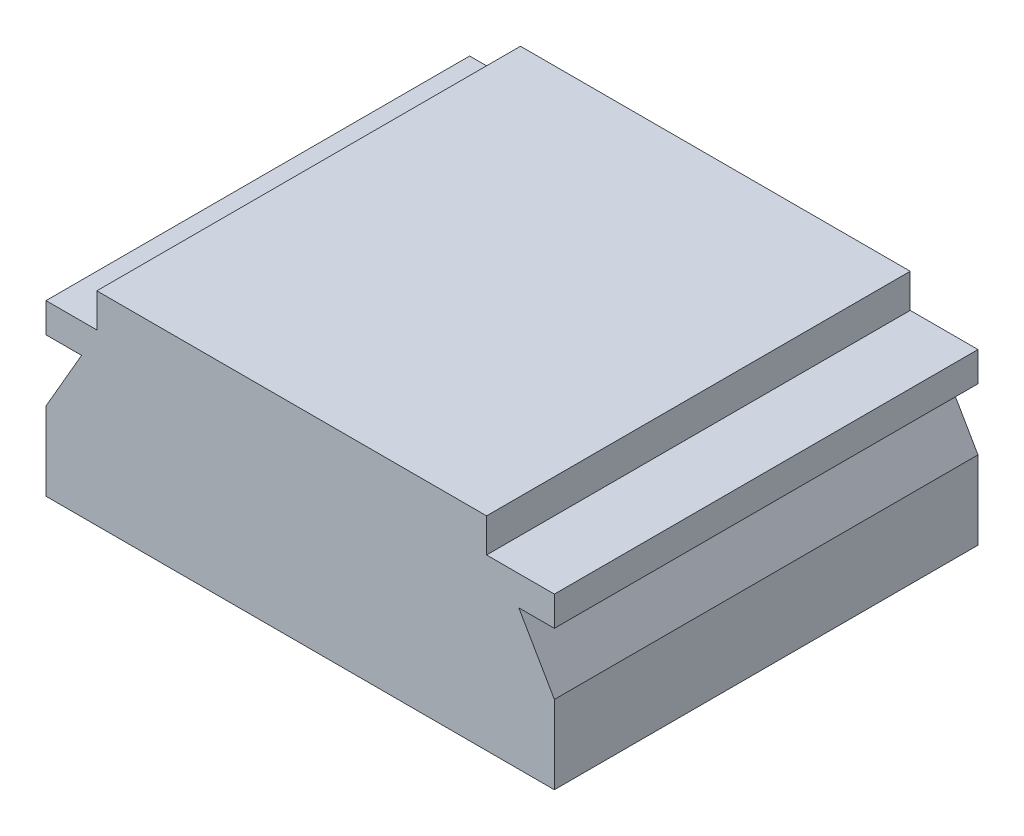
ISO-10303-21;
HEADER;
FILE_DESCRIPTION(('STEP AP214'),'2;1');
FILE_NAME('part.step','',(''),(''),'','','');
FILE_SCHEMA(('AUTOMOTIVE_DESIGN { 1 0 10303 214 1 1 1 1 }'));
ENDSEC;
DATA;
#1=APPLICATION_CONTEXT('core data for automotive mechanical design processes');
#2=APPLICATION_PROTOCOL_DEFINITION('international standard','automotive_design',2000,#1);
#3=PRODUCT_CONTEXT('',#1,'mechanical');
#4=PRODUCT('Part','Part','',(#3));
#5=PRODUCT_RELATED_PRODUCT_CATEGORY('part','',(#4));
#6=PRODUCT_DEFINITION_FORMATION('','',#4);
#7=PRODUCT_DEFINITION_CONTEXT('part definition',#1,'design');
#8=PRODUCT_DEFINITION('design','',#6,#7);
#9=PRODUCT_DEFINITION_SHAPE('','',#8);
#10=(LENGTH_UNIT() NAMED_UNIT(*) SI_UNIT(.MILLI.,.METRE.));
#11=(NAMED_UNIT(*) PLANE_ANGLE_UNIT() SI_UNIT($,.RADIAN.));
#12=(NAMED_UNIT(*) SI_UNIT($,.STERADIAN.) SOLID_ANGLE_UNIT());
#13=UNCERTAINTY_MEASURE_WITH_UNIT(LENGTH_MEASURE(1.E-05),#10,'distance_accuracy_value','');
#14=(GEOMETRIC_REPRESENTATION_CONTEXT(3) GLOBAL_UNCERTAINTY_ASSIGNED_CONTEXT((#13)) GLOBAL_UNIT_ASSIGNED_CONTEXT((#10,
#11,#12)) REPRESENTATION_CONTEXT('',''));
#15=CARTESIAN_POINT('',(0.,0.,0.));
#16=DIRECTION('',(0.,0.,1.));
#17=DIRECTION('',(1.,0.,0.));
#18=AXIS2_PLACEMENT_3D('',#15,#16,#17);
#19=CARTESIAN_POINT('',(-6.2,2.5,10.));
#20=DIRECTION('',(0.,-1.,0.));
#21=DIRECTION('',(0.,0.,-1.));
#22=AXIS2_PLACEMENT_3D('',#19,#20,#21);
#23=PLANE('',#22);
#24=DIRECTION('',(-1.,0.,0.));
#25=VECTOR('',#24,1.);
#26=CARTESIAN_POINT('',(-6.2,2.5,10.));
#27=LINE('',#26,#25);
#28=CARTESIAN_POINT('',(4.40000000000001,2.5,10.));
#29=VERTEX_POINT('',#28);
#30=CARTESIAN_POINT('',(-4.8,2.5,10.));
#31=VERTEX_POINT('',#30);
#32=EDGE_CURVE('E11',#29,#31,#27,.T.);
#33=ORIENTED_EDGE('',*,*,#32,.F.);
#34=DIRECTION('',(0.,0.,-1.));
#35=VECTOR('',#34,1.);
#36=CARTESIAN_POINT('',(4.40000000000001,2.5,10.));
#37=LINE('',#36,#35);
#38=CARTESIAN_POINT('',(4.40000000000001,2.5,0.));
#39=VERTEX_POINT('',#38);
#40=EDGE_CURVE('E64',#29,#39,#37,.T.);
#41=ORIENTED_EDGE('',*,*,#40,.T.);
#42=DIRECTION('',(-1.,0.,0.));
#43=VECTOR('',#42,1.);
#44=CARTESIAN_POINT('',(-6.2,2.5,0.));
#45=LINE('',#44,#43);
#46=CARTESIAN_POINT('',(-4.8,2.5,0.));
#47=VERTEX_POINT('',#46);
#48=EDGE_CURVE('E44',#39,#47,#45,.T.);
#49=ORIENTED_EDGE('',*,*,#48,.T.);
#50=DIRECTION('',(0.,0.,-1.));
#51=VECTOR('',#50,1.);
#52=CARTESIAN_POINT('',(-4.8,2.5,10.));
#53=LINE('',#52,#51);
#54=EDGE_CURVE('E55',#31,#47,#53,.T.);
#55=ORIENTED_EDGE('',*,*,#54,.F.);
#56=EDGE_LOOP('',(#33,#41,#49,#55));
#57=FACE_BOUND('',#56,.T.);
#58=ADVANCED_FACE('F41',(#57),#23,.F.);
#59=CARTESIAN_POINT('',(0.,0.,10.));
#60=DIRECTION('',(0.,0.,1.));
#61=DIRECTION('',(1.,0.,0.));
#62=AXIS2_PLACEMENT_3D('',#59,#60,#61);
#63=PLANE('',#62);
#64=DIRECTION('',(0.,1.,0.));
#65=VECTOR('',#64,1.);
#66=CARTESIAN_POINT('',(4.40000000000001,0.,10.));
#67=LINE('',#66,#65);
#68=CARTESIAN_POINT('',(4.40000000000001,1.69999999999999,10.));
#69=VERTEX_POINT('',#68);
#70=EDGE_CURVE('E165',#69,#29,#67,.T.);
#71=ORIENTED_EDGE('',*,*,#70,.T.);
#72=ORIENTED_EDGE('',*,*,#32,.T.);
#73=DIRECTION('',(0.,-1.,0.));
#74=VECTOR('',#73,1.);
#75=CARTESIAN_POINT('',(-4.8,0.,10.));
#76=LINE('',#75,#74);
#77=CARTESIAN_POINT('',(-4.8,1.7,10.));
#78=VERTEX_POINT('',#77);
#79=EDGE_CURVE('E114',#31,#78,#76,.T.);
#80=ORIENTED_EDGE('',*,*,#79,.T.);
#81=DIRECTION('',(-1.,0.,0.));
#82=VECTOR('',#81,1.);
#83=CARTESIAN_POINT('',(0.,1.7,10.));
#84=LINE('',#83,#82);
#85=CARTESIAN_POINT('',(-6.,1.7,10.));
#86=VERTEX_POINT('',#85);
#87=EDGE_CURVE('E237',#78,#86,#84,.T.);
#88=ORIENTED_EDGE('',*,*,#87,.T.);
#89=DIRECTION('',(0.,-1.,0.));
#90=VECTOR('',#89,1.);
#91=CARTESIAN_POINT('',(-6.,0.,10.));
#92=LINE('',#91,#90);
#93=CARTESIAN_POINT('',(-6.,1.00000000000001,10.));
#94=VERTEX_POINT('',#93);
#95=EDGE_CURVE('E250',#86,#94,#92,.T.);
#96=ORIENTED_EDGE('',*,*,#95,.T.);
#97=DIRECTION('',(1.,0.,0.));
#98=VECTOR('',#97,1.);
#99=CARTESIAN_POINT('',(0.,1.00000000000001,10.));
#100=LINE('',#99,#98);
#101=CARTESIAN_POINT('',(-5.16076951545867,1.00000000000001,10.));
#102=VERTEX_POINT('',#101);
#103=EDGE_CURVE('E252',#94,#102,#100,.T.);
#104=ORIENTED_EDGE('',*,*,#103,.T.);
#105=DIRECTION('',(-0.5,-0.866025403784439,0.));
#106=VECTOR('',#105,1.);
#107=CARTESIAN_POINT('',(-4.30358983848623,2.48467875173176,10.));
#108=LINE('',#107,#106);
#109=CARTESIAN_POINT('',(-6.,-0.453589838486223,10.));
#110=VERTEX_POINT('',#109);
#111=EDGE_CURVE('E258',#102,#110,#108,.T.);
#112=ORIENTED_EDGE('',*,*,#111,.T.);
#113=DIRECTION('',(0.,-1.,0.));
#114=VECTOR('',#113,1.);
#115=CARTESIAN_POINT('',(-6.,0.,10.));
#116=LINE('',#115,#114);
#117=CARTESIAN_POINT('',(-6.,-2.3,10.));
#118=VERTEX_POINT('',#117);
#119=EDGE_CURVE('E261',#110,#118,#116,.T.);
#120=ORIENTED_EDGE('',*,*,#119,.T.);
#121=DIRECTION('',(1.,0.,0.));
#122=VECTOR('',#121,1.);
#123=CARTESIAN_POINT('',(0.,-2.3,10.));
#124=LINE('',#123,#122);
#125=CARTESIAN_POINT('',(6.00000000000001,-2.3,10.));
#126=VERTEX_POINT('',#125);
#127=EDGE_CURVE('E264',#118,#126,#124,.T.);
#128=ORIENTED_EDGE('',*,*,#127,.T.);
#129=DIRECTION('',(0.,1.,0.));
#130=VECTOR('',#129,1.);
#131=CARTESIAN_POINT('',(6.00000000000001,0.,10.));
#132=LINE('',#131,#130);
#133=CARTESIAN_POINT('',(6.00000000000001,-0.453589838486223,10.));
#134=VERTEX_POINT('',#133);
#135=EDGE_CURVE('E267',#126,#134,#132,.T.);
#136=ORIENTED_EDGE('',*,*,#135,.T.);
#137=DIRECTION('',(-0.5,0.866025403784439,0.));
#138=VECTOR('',#137,1.);
#139=CARTESIAN_POINT('',(4.30358983848623,2.48467875173176,10.));
#140=LINE('',#139,#138);
#141=CARTESIAN_POINT('',(5.16076951545868,0.999999999999999,10.));
#142=VERTEX_POINT('',#141);
#143=EDGE_CURVE('E172',#134,#142,#140,.T.);
#144=ORIENTED_EDGE('',*,*,#143,.T.);
#145=DIRECTION('',(1.,0.,0.));
#146=VECTOR('',#145,1.);
#147=CARTESIAN_POINT('',(0.,0.999999999999999,10.));
#148=LINE('',#147,#146);
#149=CARTESIAN_POINT('',(6.00000000000001,0.999999999999999,10.));
#150=VERTEX_POINT('',#149);
#151=EDGE_CURVE('E170',#142,#150,#148,.T.);
#152=ORIENTED_EDGE('',*,*,#151,.T.);
#153=DIRECTION('',(0.,1.,0.));
#154=VECTOR('',#153,1.);
#155=CARTESIAN_POINT('',(6.00000000000001,0.,10.));
#156=LINE('',#155,#154);
#157=CARTESIAN_POINT('',(6.00000000000001,1.69999999999999,10.));
#158=VERTEX_POINT('',#157);
#159=EDGE_CURVE('E151',#150,#158,#156,.T.);
#160=ORIENTED_EDGE('',*,*,#159,.T.);
#161=DIRECTION('',(-1.,0.,0.));
#162=VECTOR('',#161,1.);
#163=CARTESIAN_POINT('',(0.,1.69999999999999,10.));
#164=LINE('',#163,#162);
#165=EDGE_CURVE('E162',#158,#69,#164,.T.);
#166=ORIENTED_EDGE('',*,*,#165,.T.);
#167=EDGE_LOOP('',(#71,#72,#80,#88,#96,#104,#112,#120,#128,#136,#144,#152,#160,#166));
#168=FACE_BOUND('',#167,.T.);
#169=ADVANCED_FACE('F167',(#168),#63,.T.);
#170=CARTESIAN_POINT('',(0.,0.,0.));
#171=DIRECTION('',(0.,0.,1.));
#172=DIRECTION('',(1.,0.,0.));
#173=AXIS2_PLACEMENT_3D('',#170,#171,#172);
#174=PLANE('',#173);
#175=ORIENTED_EDGE('',*,*,#48,.F.);
#176=DIRECTION('',(0.,1.,0.));
#177=VECTOR('',#176,1.);
#178=CARTESIAN_POINT('',(4.40000000000001,0.,0.));
#179=LINE('',#178,#177);
#180=CARTESIAN_POINT('',(4.40000000000001,1.69999999999999,0.));
#181=VERTEX_POINT('',#180);
#182=EDGE_CURVE('E109',#181,#39,#179,.T.);
#183=ORIENTED_EDGE('',*,*,#182,.F.);
#184=DIRECTION('',(-1.,0.,0.));
#185=VECTOR('',#184,1.);
#186=CARTESIAN_POINT('',(0.,1.69999999999999,0.));
#187=LINE('',#186,#185);
#188=CARTESIAN_POINT('',(6.00000000000001,1.69999999999999,0.));
#189=VERTEX_POINT('',#188);
#190=EDGE_CURVE('E207',#189,#181,#187,.T.);
#191=ORIENTED_EDGE('',*,*,#190,.F.);
#192=DIRECTION('',(0.,1.,0.));
#193=VECTOR('',#192,1.);
#194=CARTESIAN_POINT('',(6.00000000000001,0.,0.));
#195=LINE('',#194,#193);
#196=CARTESIAN_POINT('',(6.00000000000001,0.999999999999999,0.));
#197=VERTEX_POINT('',#196);
#198=EDGE_CURVE('E154',#197,#189,#195,.T.);
#199=ORIENTED_EDGE('',*,*,#198,.F.);
#200=DIRECTION('',(1.,0.,0.));
#201=VECTOR('',#200,1.);
#202=CARTESIAN_POINT('',(0.,0.999999999999999,0.));
#203=LINE('',#202,#201);
#204=CARTESIAN_POINT('',(5.16076951545868,0.999999999999999,0.));
#205=VERTEX_POINT('',#204);
#206=EDGE_CURVE('E203',#205,#197,#203,.T.);
#207=ORIENTED_EDGE('',*,*,#206,.F.);
#208=DIRECTION('',(-0.5,0.866025403784439,0.));
#209=VECTOR('',#208,1.);
#210=CARTESIAN_POINT('',(4.30358983848623,2.48467875173176,0.));
#211=LINE('',#210,#209);
#212=CARTESIAN_POINT('',(6.00000000000001,-0.453589838486223,0.));
#213=VERTEX_POINT('',#212);
#214=EDGE_CURVE('E200',#213,#205,#211,.T.);
#215=ORIENTED_EDGE('',*,*,#214,.F.);
#216=DIRECTION('',(0.,1.,0.));
#217=VECTOR('',#216,1.);
#218=CARTESIAN_POINT('',(6.00000000000001,0.,0.));
#219=LINE('',#218,#217);
#220=CARTESIAN_POINT('',(6.00000000000001,-2.3,0.));
#221=VERTEX_POINT('',#220);
#222=EDGE_CURVE('E197',#221,#213,#219,.T.);
#223=ORIENTED_EDGE('',*,*,#222,.F.);
#224=DIRECTION('',(1.,0.,0.));
#225=VECTOR('',#224,1.);
#226=CARTESIAN_POINT('',(0.,-2.3,0.));
#227=LINE('',#226,#225);
#228=CARTESIAN_POINT('',(-6.,-2.3,0.));
#229=VERTEX_POINT('',#228);
#230=EDGE_CURVE('E194',#229,#221,#227,.T.);
#231=ORIENTED_EDGE('',*,*,#230,.F.);
#232=DIRECTION('',(0.,-1.,0.));
#233=VECTOR('',#232,1.);
#234=CARTESIAN_POINT('',(-6.,0.,0.));
#235=LINE('',#234,#233);
#236=CARTESIAN_POINT('',(-6.,-0.453589838486223,0.));
#237=VERTEX_POINT('',#236);
#238=EDGE_CURVE('E191',#237,#229,#235,.T.);
#239=ORIENTED_EDGE('',*,*,#238,.F.);
#240=DIRECTION('',(-0.5,-0.866025403784439,0.));
#241=VECTOR('',#240,1.);
#242=CARTESIAN_POINT('',(-4.30358983848623,2.48467875173176,0.));
#243=LINE('',#242,#241);
#244=CARTESIAN_POINT('',(-5.16076951545867,1.00000000000001,0.));
#245=VERTEX_POINT('',#244);
#246=EDGE_CURVE('E188',#245,#237,#243,.T.);
#247=ORIENTED_EDGE('',*,*,#246,.F.);
#248=DIRECTION('',(1.,0.,0.));
#249=VECTOR('',#248,1.);
#250=CARTESIAN_POINT('',(0.,1.00000000000001,0.));
#251=LINE('',#250,#249);
#252=CARTESIAN_POINT('',(-6.,1.00000000000001,0.));
#253=VERTEX_POINT('',#252);
#254=EDGE_CURVE('E185',#253,#245,#251,.T.);
#255=ORIENTED_EDGE('',*,*,#254,.F.);
#256=DIRECTION('',(0.,-1.,0.));
#257=VECTOR('',#256,1.);
#258=CARTESIAN_POINT('',(-6.,0.,0.));
#259=LINE('',#258,#257);
#260=CARTESIAN_POINT('',(-6.,1.7,0.));
#261=VERTEX_POINT('',#260);
#262=EDGE_CURVE('E182',#261,#253,#259,.T.);
#263=ORIENTED_EDGE('',*,*,#262,.F.);
#264=DIRECTION('',(-1.,0.,0.));
#265=VECTOR('',#264,1.);
#266=CARTESIAN_POINT('',(0.,1.7,0.));
#267=LINE('',#266,#265);
#268=CARTESIAN_POINT('',(-4.8,1.7,0.));
#269=VERTEX_POINT('',#268);
#270=EDGE_CURVE('E179',#269,#261,#267,.T.);
#271=ORIENTED_EDGE('',*,*,#270,.F.);
#272=DIRECTION('',(0.,-1.,0.));
#273=VECTOR('',#272,1.);
#274=CARTESIAN_POINT('',(-4.8,0.,0.));
#275=LINE('',#274,#273);
#276=EDGE_CURVE('E177',#47,#269,#275,.T.);
#277=ORIENTED_EDGE('',*,*,#276,.F.);
#278=EDGE_LOOP('',(#175,#183,#191,#199,#207,#215,#223,#231,#239,#247,#255,#263,#271,#277));
#279=FACE_BOUND('',#278,.T.);
#280=ADVANCED_FACE('F242',(#279),#174,.F.);
#281=CARTESIAN_POINT('',(4.40000000000001,0.,10.));
#282=DIRECTION('',(-1.,0.,0.));
#283=DIRECTION('',(0.,0.,1.));
#284=AXIS2_PLACEMENT_3D('',#281,#282,#283);
#285=PLANE('',#284);
#286=ORIENTED_EDGE('',*,*,#182,.T.);
#287=ORIENTED_EDGE('',*,*,#40,.F.);
#288=ORIENTED_EDGE('',*,*,#70,.F.);
#289=DIRECTION('',(0.,0.,-1.));
#290=VECTOR('',#289,1.);
#291=CARTESIAN_POINT('',(4.40000000000001,1.69999999999999,10.));
#292=LINE('',#291,#290);
#293=EDGE_CURVE('E158',#69,#181,#292,.T.);
#294=ORIENTED_EDGE('',*,*,#293,.T.);
#295=EDGE_LOOP('',(#286,#287,#288,#294));
#296=FACE_BOUND('',#295,.T.);
#297=ADVANCED_FACE('F279',(#296),#285,.F.);
#298=CARTESIAN_POINT('',(0.,1.69999999999999,10.));
#299=DIRECTION('',(0.,-1.,0.));
#300=DIRECTION('',(0.,0.,-1.));
#301=AXIS2_PLACEMENT_3D('',#298,#299,#300);
#302=PLANE('',#301);
#303=ORIENTED_EDGE('',*,*,#190,.T.);
#304=ORIENTED_EDGE('',*,*,#293,.F.);
#305=ORIENTED_EDGE('',*,*,#165,.F.);
#306=DIRECTION('',(0.,0.,-1.));
#307=VECTOR('',#306,1.);
#308=CARTESIAN_POINT('',(6.00000000000001,1.69999999999999,10.));
#309=LINE('',#308,#307);
#310=EDGE_CURVE('E147',#158,#189,#309,.T.);
#311=ORIENTED_EDGE('',*,*,#310,.T.);
#312=EDGE_LOOP('',(#303,#304,#305,#311));
#313=FACE_BOUND('',#312,.T.);
#314=ADVANCED_FACE('F163',(#313),#302,.F.);
#315=CARTESIAN_POINT('',(6.00000000000001,0.,10.));
#316=DIRECTION('',(-1.,0.,0.));
#317=DIRECTION('',(0.,0.,1.));
#318=AXIS2_PLACEMENT_3D('',#315,#316,#317);
#319=PLANE('',#318);
#320=ORIENTED_EDGE('',*,*,#198,.T.);
#321=ORIENTED_EDGE('',*,*,#310,.F.);
#322=ORIENTED_EDGE('',*,*,#159,.F.);
#323=DIRECTION('',(0.,0.,-1.));
#324=VECTOR('',#323,1.);
#325=CARTESIAN_POINT('',(6.00000000000001,0.999999999999999,10.));
#326=LINE('',#325,#324);
#327=EDGE_CURVE('E159',#150,#197,#326,.T.);
#328=ORIENTED_EDGE('',*,*,#327,.T.);
#329=EDGE_LOOP('',(#320,#321,#322,#328));
#330=FACE_BOUND('',#329,.T.);
#331=ADVANCED_FACE('F149',(#330),#319,.F.);
#332=CARTESIAN_POINT('',(0.,0.999999999999999,10.));
#333=DIRECTION('',(0.,1.,0.));
#334=DIRECTION('',(0.,0.,1.));
#335=AXIS2_PLACEMENT_3D('',#332,#333,#334);
#336=PLANE('',#335);
#337=ORIENTED_EDGE('',*,*,#206,.T.);
#338=ORIENTED_EDGE('',*,*,#327,.F.);
#339=ORIENTED_EDGE('',*,*,#151,.F.);
#340=DIRECTION('',(0.,0.,-1.));
#341=VECTOR('',#340,1.);
#342=CARTESIAN_POINT('',(5.16076951545868,0.999999999999999,10.));
#343=LINE('',#342,#341);
#344=EDGE_CURVE('E213',#142,#205,#343,.T.);
#345=ORIENTED_EDGE('',*,*,#344,.T.);
#346=EDGE_LOOP('',(#337,#338,#339,#345));
#347=FACE_BOUND('',#346,.T.);
#348=ADVANCED_FACE('F276',(#347),#336,.F.);
#349=CARTESIAN_POINT('',(4.30358983848623,2.48467875173176,10.));
#350=DIRECTION('',(-0.866025403784439,-0.5,0.));
#351=DIRECTION('',(0.5,-0.866025403784439,0.));
#352=AXIS2_PLACEMENT_3D('',#349,#350,#351);
#353=PLANE('',#352);
#354=ORIENTED_EDGE('',*,*,#214,.T.);
#355=ORIENTED_EDGE('',*,*,#344,.F.);
#356=ORIENTED_EDGE('',*,*,#143,.F.);
#357=DIRECTION('',(0.,0.,-1.));
#358=VECTOR('',#357,1.);
#359=CARTESIAN_POINT('',(6.00000000000001,-0.453589838486223,10.));
#360=LINE('',#359,#358);
#361=EDGE_CURVE('E215',#134,#213,#360,.T.);
#362=ORIENTED_EDGE('',*,*,#361,.T.);
#363=EDGE_LOOP('',(#354,#355,#356,#362));
#364=FACE_BOUND('',#363,.T.);
#365=ADVANCED_FACE('F272',(#364),#353,.F.);
#366=CARTESIAN_POINT('',(6.00000000000001,0.,10.));
#367=DIRECTION('',(-1.,0.,0.));
#368=DIRECTION('',(0.,0.,1.));
#369=AXIS2_PLACEMENT_3D('',#366,#367,#368);
#370=PLANE('',#369);
#371=ORIENTED_EDGE('',*,*,#222,.T.);
#372=ORIENTED_EDGE('',*,*,#361,.F.);
#373=ORIENTED_EDGE('',*,*,#135,.F.);
#374=DIRECTION('',(0.,0.,-1.));
#375=VECTOR('',#374,1.);
#376=CARTESIAN_POINT('',(6.00000000000001,-2.3,10.));
#377=LINE('',#376,#375);
#378=EDGE_CURVE('E217',#126,#221,#377,.T.);
#379=ORIENTED_EDGE('',*,*,#378,.T.);
#380=EDGE_LOOP('',(#371,#372,#373,#379));
#381=FACE_BOUND('',#380,.T.);
#382=ADVANCED_FACE('F316',(#381),#370,.F.);
#383=CARTESIAN_POINT('',(0.,-2.3,10.));
#384=DIRECTION('',(0.,1.,0.));
#385=DIRECTION('',(0.,0.,1.));
#386=AXIS2_PLACEMENT_3D('',#383,#384,#385);
#387=PLANE('',#386);
#388=ORIENTED_EDGE('',*,*,#230,.T.);
#389=ORIENTED_EDGE('',*,*,#378,.F.);
#390=ORIENTED_EDGE('',*,*,#127,.F.);
#391=DIRECTION('',(0.,0.,-1.));
#392=VECTOR('',#391,1.);
#393=CARTESIAN_POINT('',(-6.,-2.3,10.));
#394=LINE('',#393,#392);
#395=EDGE_CURVE('E219',#118,#229,#394,.T.);
#396=ORIENTED_EDGE('',*,*,#395,.T.);
#397=EDGE_LOOP('',(#388,#389,#390,#396));
#398=FACE_BOUND('',#397,.T.);
#399=ADVANCED_FACE('F312',(#398),#387,.F.);
#400=CARTESIAN_POINT('',(-6.,0.,10.));
#401=DIRECTION('',(1.,0.,0.));
#402=DIRECTION('',(0.,0.,-1.));
#403=AXIS2_PLACEMENT_3D('',#400,#401,#402);
#404=PLANE('',#403);
#405=ORIENTED_EDGE('',*,*,#238,.T.);
#406=ORIENTED_EDGE('',*,*,#395,.F.);
#407=ORIENTED_EDGE('',*,*,#119,.F.);
#408=DIRECTION('',(0.,0.,-1.));
#409=VECTOR('',#408,1.);
#410=CARTESIAN_POINT('',(-6.,-0.453589838486223,10.));
#411=LINE('',#410,#409);
#412=EDGE_CURVE('E221',#110,#237,#411,.T.);
#413=ORIENTED_EDGE('',*,*,#412,.T.);
#414=EDGE_LOOP('',(#405,#406,#407,#413));
#415=FACE_BOUND('',#414,.T.);
#416=ADVANCED_FACE('F308',(#415),#404,.F.);
#417=CARTESIAN_POINT('',(-4.30358983848623,2.48467875173176,10.));
#418=DIRECTION('',(0.866025403784439,-0.5,0.));
#419=DIRECTION('',(0.5,0.866025403784439,0.));
#420=AXIS2_PLACEMENT_3D('',#417,#418,#419);
#421=PLANE('',#420);
#422=ORIENTED_EDGE('',*,*,#246,.T.);
#423=ORIENTED_EDGE('',*,*,#412,.F.);
#424=ORIENTED_EDGE('',*,*,#111,.F.);
#425=DIRECTION('',(0.,0.,-1.));
#426=VECTOR('',#425,1.);
#427=CARTESIAN_POINT('',(-5.16076951545867,1.00000000000001,10.));
#428=LINE('',#427,#426);
#429=EDGE_CURVE('E223',#102,#245,#428,.T.);
#430=ORIENTED_EDGE('',*,*,#429,.T.);
#431=EDGE_LOOP('',(#422,#423,#424,#430));
#432=FACE_BOUND('',#431,.T.);
#433=ADVANCED_FACE('F304',(#432),#421,.F.);
#434=CARTESIAN_POINT('',(0.,1.00000000000001,10.));
#435=DIRECTION('',(0.,1.,0.));
#436=DIRECTION('',(0.,0.,1.));
#437=AXIS2_PLACEMENT_3D('',#434,#435,#436);
#438=PLANE('',#437);
#439=ORIENTED_EDGE('',*,*,#254,.T.);
#440=ORIENTED_EDGE('',*,*,#429,.F.);
#441=ORIENTED_EDGE('',*,*,#103,.F.);
#442=DIRECTION('',(0.,0.,-1.));
#443=VECTOR('',#442,1.);
#444=CARTESIAN_POINT('',(-6.,1.00000000000001,10.));
#445=LINE('',#444,#443);
#446=EDGE_CURVE('E225',#94,#253,#445,.T.);
#447=ORIENTED_EDGE('',*,*,#446,.T.);
#448=EDGE_LOOP('',(#439,#440,#441,#447));
#449=FACE_BOUND('',#448,.T.);
#450=ADVANCED_FACE('F301',(#449),#438,.F.);
#451=CARTESIAN_POINT('',(-6.,0.,10.));
#452=DIRECTION('',(1.,0.,0.));
#453=DIRECTION('',(0.,0.,-1.));
#454=AXIS2_PLACEMENT_3D('',#451,#452,#453);
#455=PLANE('',#454);
#456=ORIENTED_EDGE('',*,*,#262,.T.);
#457=ORIENTED_EDGE('',*,*,#446,.F.);
#458=ORIENTED_EDGE('',*,*,#95,.F.);
#459=DIRECTION('',(0.,0.,-1.));
#460=VECTOR('',#459,1.);
#461=CARTESIAN_POINT('',(-6.,1.7,10.));
#462=LINE('',#461,#460);
#463=EDGE_CURVE('E227',#86,#261,#462,.T.);
#464=ORIENTED_EDGE('',*,*,#463,.T.);
#465=EDGE_LOOP('',(#456,#457,#458,#464));
#466=FACE_BOUND('',#465,.T.);
#467=ADVANCED_FACE('F246',(#466),#455,.F.);
#468=CARTESIAN_POINT('',(0.,1.7,10.));
#469=DIRECTION('',(0.,-1.,0.));
#470=DIRECTION('',(0.,0.,-1.));
#471=AXIS2_PLACEMENT_3D('',#468,#469,#470);
#472=PLANE('',#471);
#473=ORIENTED_EDGE('',*,*,#270,.T.);
#474=ORIENTED_EDGE('',*,*,#463,.F.);
#475=ORIENTED_EDGE('',*,*,#87,.F.);
#476=DIRECTION('',(0.,0.,-1.));
#477=VECTOR('',#476,1.);
#478=CARTESIAN_POINT('',(-4.8,1.7,10.));
#479=LINE('',#478,#477);
#480=EDGE_CURVE('E229',#78,#269,#479,.T.);
#481=ORIENTED_EDGE('',*,*,#480,.T.);
#482=EDGE_LOOP('',(#473,#474,#475,#481));
#483=FACE_BOUND('',#482,.T.);
#484=ADVANCED_FACE('F233',(#483),#472,.F.);
#485=CARTESIAN_POINT('',(-4.8,0.,10.));
#486=DIRECTION('',(1.,0.,0.));
#487=DIRECTION('',(0.,0.,-1.));
#488=AXIS2_PLACEMENT_3D('',#485,#486,#487);
#489=PLANE('',#488);
#490=ORIENTED_EDGE('',*,*,#276,.T.);
#491=ORIENTED_EDGE('',*,*,#480,.F.);
#492=ORIENTED_EDGE('',*,*,#79,.F.);
#493=ORIENTED_EDGE('',*,*,#54,.T.);
#494=EDGE_LOOP('',(#490,#491,#492,#493));
#495=FACE_BOUND('',#494,.T.);
#496=ADVANCED_FACE('F238',(#495),#489,.F.);
#497=CLOSED_SHELL('',(#58,#169,#280,#297,#314,#331,#348,#365,#382,#399,#416,#433,#450,#467,#484,#496));
#498=MANIFOLD_SOLID_BREP('B2',#497);
#499=ADVANCED_BREP_SHAPE_REPRESENTATION('',(#18,#498),#14);
#500=SHAPE_DEFINITION_REPRESENTATION(#9,#499);
ENDSEC;
END-ISO-10303-21;
